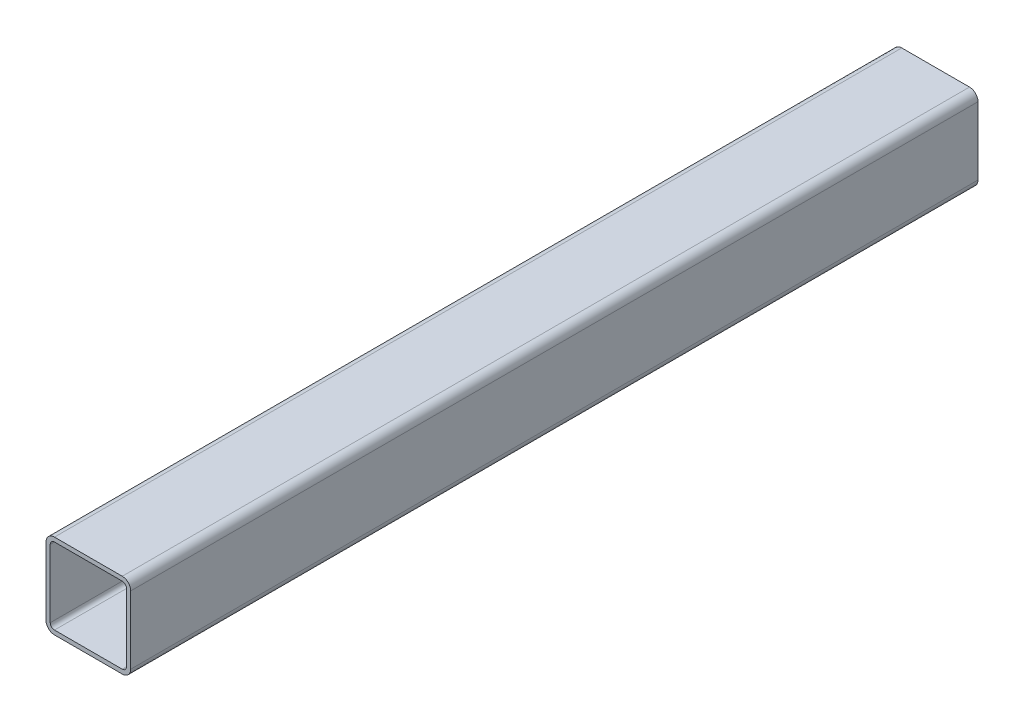
ISO-10303-21;
HEADER;
FILE_DESCRIPTION(('STEP AP214'),'2;1');
FILE_NAME('part.step','',(''),(''),'','','');
FILE_SCHEMA(('AUTOMOTIVE_DESIGN { 1 0 10303 214 1 1 1 1 }'));
ENDSEC;
DATA;
#1=APPLICATION_CONTEXT('core data for automotive mechanical design processes');
#2=APPLICATION_PROTOCOL_DEFINITION('international standard','automotive_design',2000,#1);
#3=PRODUCT_CONTEXT('',#1,'mechanical');
#4=PRODUCT('Part','Part','',(#3));
#5=PRODUCT_RELATED_PRODUCT_CATEGORY('part','',(#4));
#6=PRODUCT_DEFINITION_FORMATION('','',#4);
#7=PRODUCT_DEFINITION_CONTEXT('part definition',#1,'design');
#8=PRODUCT_DEFINITION('design','',#6,#7);
#9=PRODUCT_DEFINITION_SHAPE('','',#8);
#10=(LENGTH_UNIT() NAMED_UNIT(*) SI_UNIT(.MILLI.,.METRE.));
#11=(NAMED_UNIT(*) PLANE_ANGLE_UNIT() SI_UNIT($,.RADIAN.));
#12=(NAMED_UNIT(*) SI_UNIT($,.STERADIAN.) SOLID_ANGLE_UNIT());
#13=UNCERTAINTY_MEASURE_WITH_UNIT(LENGTH_MEASURE(1.E-05),#10,'distance_accuracy_value','');
#14=(GEOMETRIC_REPRESENTATION_CONTEXT(3) GLOBAL_UNCERTAINTY_ASSIGNED_CONTEXT((#13)) GLOBAL_UNIT_ASSIGNED_CONTEXT((#10,
#11,#12)) REPRESENTATION_CONTEXT('',''));
#15=CARTESIAN_POINT('',(0.,0.,0.));
#16=DIRECTION('',(0.,0.,1.));
#17=DIRECTION('',(1.,0.,0.));
#18=AXIS2_PLACEMENT_3D('',#15,#16,#17);
#19=CARTESIAN_POINT('',(-40.,-40.,1000.));
#20=DIRECTION('',(0.,0.,-1.));
#21=DIRECTION('',(-1.,0.,0.));
#22=AXIS2_PLACEMENT_3D('',#19,#20,#21);
#23=CYLINDRICAL_SURFACE('',#22,10.);
#24=CARTESIAN_POINT('',(-40.,-40.,0.));
#25=DIRECTION('',(0.,0.,1.));
#26=DIRECTION('',(1.,0.,0.));
#27=AXIS2_PLACEMENT_3D('',#24,#25,#26);
#28=CIRCLE('',#27,10.);
#29=CARTESIAN_POINT('',(-50.,-40.,0.));
#30=VERTEX_POINT('',#29);
#31=CARTESIAN_POINT('',(-40.,-50.,0.));
#32=VERTEX_POINT('',#31);
#33=EDGE_CURVE('E245',#30,#32,#28,.T.);
#34=ORIENTED_EDGE('',*,*,#33,.T.);
#35=DIRECTION('',(0.,0.,-1.));
#36=VECTOR('',#35,1.);
#37=CARTESIAN_POINT('',(-40.,-50.,1000.));
#38=LINE('',#37,#36);
#39=CARTESIAN_POINT('',(-40.,-50.,1000.));
#40=VERTEX_POINT('',#39);
#41=EDGE_CURVE('E12',#40,#32,#38,.T.);
#42=ORIENTED_EDGE('',*,*,#41,.F.);
#43=CARTESIAN_POINT('',(-40.,-40.,1000.));
#44=DIRECTION('',(0.,0.,1.));
#45=DIRECTION('',(1.,0.,0.));
#46=AXIS2_PLACEMENT_3D('',#43,#44,#45);
#47=CIRCLE('',#46,10.);
#48=CARTESIAN_POINT('',(-50.,-40.,1000.));
#49=VERTEX_POINT('',#48);
#50=EDGE_CURVE('E321',#49,#40,#47,.T.);
#51=ORIENTED_EDGE('',*,*,#50,.F.);
#52=DIRECTION('',(0.,0.,-1.));
#53=VECTOR('',#52,1.);
#54=CARTESIAN_POINT('',(-50.,-40.,1000.));
#55=LINE('',#54,#53);
#56=EDGE_CURVE('E256',#49,#30,#55,.T.);
#57=ORIENTED_EDGE('',*,*,#56,.T.);
#58=EDGE_LOOP('',(#34,#42,#51,#57));
#59=FACE_BOUND('',#58,.T.);
#60=ADVANCED_FACE('F72',(#59),#23,.T.);
#61=CARTESIAN_POINT('',(-40.,-50.,1000.));
#62=DIRECTION('',(0.,1.,0.));
#63=DIRECTION('',(0.,0.,1.));
#64=AXIS2_PLACEMENT_3D('',#61,#62,#63);
#65=PLANE('',#64);
#66=DIRECTION('',(1.,0.,0.));
#67=VECTOR('',#66,1.);
#68=CARTESIAN_POINT('',(-40.,-50.,0.));
#69=LINE('',#68,#67);
#70=CARTESIAN_POINT('',(40.,-50.,0.));
#71=VERTEX_POINT('',#70);
#72=EDGE_CURVE('E247',#32,#71,#69,.T.);
#73=ORIENTED_EDGE('',*,*,#72,.T.);
#74=DIRECTION('',(0.,0.,-1.));
#75=VECTOR('',#74,1.);
#76=CARTESIAN_POINT('',(40.,-50.,1000.));
#77=LINE('',#76,#75);
#78=CARTESIAN_POINT('',(40.,-50.,1000.));
#79=VERTEX_POINT('',#78);
#80=EDGE_CURVE('E83',#79,#71,#77,.T.);
#81=ORIENTED_EDGE('',*,*,#80,.F.);
#82=DIRECTION('',(1.,0.,0.));
#83=VECTOR('',#82,1.);
#84=CARTESIAN_POINT('',(-40.,-50.,1000.));
#85=LINE('',#84,#83);
#86=EDGE_CURVE('E322',#40,#79,#85,.T.);
#87=ORIENTED_EDGE('',*,*,#86,.F.);
#88=ORIENTED_EDGE('',*,*,#41,.T.);
#89=EDGE_LOOP('',(#73,#81,#87,#88));
#90=FACE_BOUND('',#89,.T.);
#91=ADVANCED_FACE('F358',(#90),#65,.F.);
#92=CARTESIAN_POINT('',(40.,-40.,1000.));
#93=DIRECTION('',(0.,0.,-1.));
#94=DIRECTION('',(-1.,0.,0.));
#95=AXIS2_PLACEMENT_3D('',#92,#93,#94);
#96=CYLINDRICAL_SURFACE('',#95,10.);
#97=CARTESIAN_POINT('',(40.,-40.,0.));
#98=DIRECTION('',(0.,0.,1.));
#99=DIRECTION('',(1.,0.,0.));
#100=AXIS2_PLACEMENT_3D('',#97,#98,#99);
#101=CIRCLE('',#100,10.);
#102=CARTESIAN_POINT('',(50.,-40.,0.));
#103=VERTEX_POINT('',#102);
#104=EDGE_CURVE('E246',#71,#103,#101,.T.);
#105=ORIENTED_EDGE('',*,*,#104,.T.);
#106=DIRECTION('',(0.,0.,-1.));
#107=VECTOR('',#106,1.);
#108=CARTESIAN_POINT('',(50.,-40.,1000.));
#109=LINE('',#108,#107);
#110=CARTESIAN_POINT('',(50.,-40.,1000.));
#111=VERTEX_POINT('',#110);
#112=EDGE_CURVE('E262',#111,#103,#109,.T.);
#113=ORIENTED_EDGE('',*,*,#112,.F.);
#114=CARTESIAN_POINT('',(40.,-40.,1000.));
#115=DIRECTION('',(0.,0.,1.));
#116=DIRECTION('',(1.,0.,0.));
#117=AXIS2_PLACEMENT_3D('',#114,#115,#116);
#118=CIRCLE('',#117,10.);
#119=EDGE_CURVE('E324',#79,#111,#118,.T.);
#120=ORIENTED_EDGE('',*,*,#119,.F.);
#121=ORIENTED_EDGE('',*,*,#80,.T.);
#122=EDGE_LOOP('',(#105,#113,#120,#121));
#123=FACE_BOUND('',#122,.T.);
#124=ADVANCED_FACE('F363',(#123),#96,.T.);
#125=CARTESIAN_POINT('',(50.,-40.,1000.));
#126=DIRECTION('',(-1.,0.,0.));
#127=DIRECTION('',(0.,0.,1.));
#128=AXIS2_PLACEMENT_3D('',#125,#126,#127);
#129=PLANE('',#128);
#130=DIRECTION('',(0.,1.,0.));
#131=VECTOR('',#130,1.);
#132=CARTESIAN_POINT('',(50.,-40.,0.));
#133=LINE('',#132,#131);
#134=CARTESIAN_POINT('',(50.,40.,0.));
#135=VERTEX_POINT('',#134);
#136=EDGE_CURVE('E248',#103,#135,#133,.T.);
#137=ORIENTED_EDGE('',*,*,#136,.T.);
#138=DIRECTION('',(0.,0.,-1.));
#139=VECTOR('',#138,1.);
#140=CARTESIAN_POINT('',(50.,40.,1000.));
#141=LINE('',#140,#139);
#142=CARTESIAN_POINT('',(50.,40.,1000.));
#143=VERTEX_POINT('',#142);
#144=EDGE_CURVE('E265',#143,#135,#141,.T.);
#145=ORIENTED_EDGE('',*,*,#144,.F.);
#146=DIRECTION('',(0.,1.,0.));
#147=VECTOR('',#146,1.);
#148=CARTESIAN_POINT('',(50.,-40.,1000.));
#149=LINE('',#148,#147);
#150=EDGE_CURVE('E330',#111,#143,#149,.T.);
#151=ORIENTED_EDGE('',*,*,#150,.F.);
#152=ORIENTED_EDGE('',*,*,#112,.T.);
#153=EDGE_LOOP('',(#137,#145,#151,#152));
#154=FACE_BOUND('',#153,.T.);
#155=ADVANCED_FACE('F335',(#154),#129,.F.);
#156=CARTESIAN_POINT('',(40.,40.,1000.));
#157=DIRECTION('',(0.,0.,-1.));
#158=DIRECTION('',(-1.,0.,0.));
#159=AXIS2_PLACEMENT_3D('',#156,#157,#158);
#160=CYLINDRICAL_SURFACE('',#159,10.);
#161=CARTESIAN_POINT('',(40.,40.,0.));
#162=DIRECTION('',(0.,0.,1.));
#163=DIRECTION('',(1.,0.,0.));
#164=AXIS2_PLACEMENT_3D('',#161,#162,#163);
#165=CIRCLE('',#164,10.);
#166=CARTESIAN_POINT('',(40.,50.,0.));
#167=VERTEX_POINT('',#166);
#168=EDGE_CURVE('E254',#135,#167,#165,.T.);
#169=ORIENTED_EDGE('',*,*,#168,.T.);
#170=DIRECTION('',(0.,0.,-1.));
#171=VECTOR('',#170,1.);
#172=CARTESIAN_POINT('',(40.,50.,1000.));
#173=LINE('',#172,#171);
#174=CARTESIAN_POINT('',(40.,50.,1000.));
#175=VERTEX_POINT('',#174);
#176=EDGE_CURVE('E208',#175,#167,#173,.T.);
#177=ORIENTED_EDGE('',*,*,#176,.F.);
#178=CARTESIAN_POINT('',(40.,40.,1000.));
#179=DIRECTION('',(0.,0.,1.));
#180=DIRECTION('',(1.,0.,0.));
#181=AXIS2_PLACEMENT_3D('',#178,#179,#180);
#182=CIRCLE('',#181,10.);
#183=EDGE_CURVE('E202',#143,#175,#182,.T.);
#184=ORIENTED_EDGE('',*,*,#183,.F.);
#185=ORIENTED_EDGE('',*,*,#144,.T.);
#186=EDGE_LOOP('',(#169,#177,#184,#185));
#187=FACE_BOUND('',#186,.T.);
#188=ADVANCED_FACE('F340',(#187),#160,.T.);
#189=CARTESIAN_POINT('',(40.,50.,1000.));
#190=DIRECTION('',(0.,-1.,0.));
#191=DIRECTION('',(0.,0.,-1.));
#192=AXIS2_PLACEMENT_3D('',#189,#190,#191);
#193=PLANE('',#192);
#194=DIRECTION('',(-1.,0.,0.));
#195=VECTOR('',#194,1.);
#196=CARTESIAN_POINT('',(40.,50.,0.));
#197=LINE('',#196,#195);
#198=CARTESIAN_POINT('',(-40.,50.,0.));
#199=VERTEX_POINT('',#198);
#200=EDGE_CURVE('E206',#167,#199,#197,.T.);
#201=ORIENTED_EDGE('',*,*,#200,.T.);
#202=DIRECTION('',(0.,0.,-1.));
#203=VECTOR('',#202,1.);
#204=CARTESIAN_POINT('',(-40.,50.,1000.));
#205=LINE('',#204,#203);
#206=CARTESIAN_POINT('',(-40.,50.,1000.));
#207=VERTEX_POINT('',#206);
#208=EDGE_CURVE('E207',#207,#199,#205,.T.);
#209=ORIENTED_EDGE('',*,*,#208,.F.);
#210=DIRECTION('',(-1.,0.,0.));
#211=VECTOR('',#210,1.);
#212=CARTESIAN_POINT('',(40.,50.,1000.));
#213=LINE('',#212,#211);
#214=EDGE_CURVE('E193',#175,#207,#213,.T.);
#215=ORIENTED_EDGE('',*,*,#214,.F.);
#216=ORIENTED_EDGE('',*,*,#176,.T.);
#217=EDGE_LOOP('',(#201,#209,#215,#216));
#218=FACE_BOUND('',#217,.T.);
#219=ADVANCED_FACE('F209',(#218),#193,.F.);
#220=CARTESIAN_POINT('',(-40.,40.,1000.));
#221=DIRECTION('',(0.,0.,-1.));
#222=DIRECTION('',(-1.,0.,0.));
#223=AXIS2_PLACEMENT_3D('',#220,#221,#222);
#224=CYLINDRICAL_SURFACE('',#223,10.);
#225=CARTESIAN_POINT('',(-40.,40.,0.));
#226=DIRECTION('',(0.,0.,1.));
#227=DIRECTION('',(1.,0.,0.));
#228=AXIS2_PLACEMENT_3D('',#225,#226,#227);
#229=CIRCLE('',#228,10.);
#230=CARTESIAN_POINT('',(-50.,40.,0.));
#231=VERTEX_POINT('',#230);
#232=EDGE_CURVE('E142',#199,#231,#229,.T.);
#233=ORIENTED_EDGE('',*,*,#232,.T.);
#234=DIRECTION('',(0.,0.,-1.));
#235=VECTOR('',#234,1.);
#236=CARTESIAN_POINT('',(-50.,40.,1000.));
#237=LINE('',#236,#235);
#238=CARTESIAN_POINT('',(-50.,40.,1000.));
#239=VERTEX_POINT('',#238);
#240=EDGE_CURVE('E213',#239,#231,#237,.T.);
#241=ORIENTED_EDGE('',*,*,#240,.F.);
#242=CARTESIAN_POINT('',(-40.,40.,1000.));
#243=DIRECTION('',(0.,0.,1.));
#244=DIRECTION('',(1.,0.,0.));
#245=AXIS2_PLACEMENT_3D('',#242,#243,#244);
#246=CIRCLE('',#245,10.);
#247=EDGE_CURVE('E196',#207,#239,#246,.T.);
#248=ORIENTED_EDGE('',*,*,#247,.F.);
#249=ORIENTED_EDGE('',*,*,#208,.T.);
#250=EDGE_LOOP('',(#233,#241,#248,#249));
#251=FACE_BOUND('',#250,.T.);
#252=ADVANCED_FACE('F211',(#251),#224,.T.);
#253=CARTESIAN_POINT('',(-40.,-40.,1000.));
#254=DIRECTION('',(0.,0.,-1.));
#255=DIRECTION('',(-1.,0.,0.));
#256=AXIS2_PLACEMENT_3D('',#253,#254,#255);
#257=CYLINDRICAL_SURFACE('',#256,5.);
#258=CARTESIAN_POINT('',(-40.,-40.,0.));
#259=DIRECTION('',(0.,0.,1.));
#260=DIRECTION('',(1.,0.,0.));
#261=AXIS2_PLACEMENT_3D('',#258,#259,#260);
#262=CIRCLE('',#261,5.);
#263=CARTESIAN_POINT('',(-45.,-40.,0.));
#264=VERTEX_POINT('',#263);
#265=CARTESIAN_POINT('',(-40.,-45.,0.));
#266=VERTEX_POINT('',#265);
#267=EDGE_CURVE('E219',#264,#266,#262,.T.);
#268=ORIENTED_EDGE('',*,*,#267,.F.);
#269=DIRECTION('',(0.,0.,-1.));
#270=VECTOR('',#269,1.);
#271=CARTESIAN_POINT('',(-45.,-40.,1000.));
#272=LINE('',#271,#270);
#273=CARTESIAN_POINT('',(-45.,-40.,1000.));
#274=VERTEX_POINT('',#273);
#275=EDGE_CURVE('E73',#274,#264,#272,.T.);
#276=ORIENTED_EDGE('',*,*,#275,.F.);
#277=CARTESIAN_POINT('',(-40.,-40.,1000.));
#278=DIRECTION('',(0.,0.,1.));
#279=DIRECTION('',(1.,0.,0.));
#280=AXIS2_PLACEMENT_3D('',#277,#278,#279);
#281=CIRCLE('',#280,5.);
#282=CARTESIAN_POINT('',(-40.,-45.,1000.));
#283=VERTEX_POINT('',#282);
#284=EDGE_CURVE('E257',#274,#283,#281,.T.);
#285=ORIENTED_EDGE('',*,*,#284,.T.);
#286=DIRECTION('',(0.,0.,-1.));
#287=VECTOR('',#286,1.);
#288=CARTESIAN_POINT('',(-40.,-45.,1000.));
#289=LINE('',#288,#287);
#290=EDGE_CURVE('E214',#283,#266,#289,.T.);
#291=ORIENTED_EDGE('',*,*,#290,.T.);
#292=EDGE_LOOP('',(#268,#276,#285,#291));
#293=FACE_BOUND('',#292,.T.);
#294=ADVANCED_FACE('F75',(#293),#257,.F.);
#295=CARTESIAN_POINT('',(-45.,40.,1000.));
#296=DIRECTION('',(1.,0.,0.));
#297=DIRECTION('',(0.,0.,-1.));
#298=AXIS2_PLACEMENT_3D('',#295,#296,#297);
#299=PLANE('',#298);
#300=DIRECTION('',(0.,-1.,0.));
#301=VECTOR('',#300,1.);
#302=CARTESIAN_POINT('',(-45.,40.,0.));
#303=LINE('',#302,#301);
#304=CARTESIAN_POINT('',(-45.,40.,0.));
#305=VERTEX_POINT('',#304);
#306=EDGE_CURVE('E225',#305,#264,#303,.T.);
#307=ORIENTED_EDGE('',*,*,#306,.F.);
#308=DIRECTION('',(0.,0.,-1.));
#309=VECTOR('',#308,1.);
#310=CARTESIAN_POINT('',(-45.,40.,1000.));
#311=LINE('',#310,#309);
#312=CARTESIAN_POINT('',(-45.,40.,1000.));
#313=VERTEX_POINT('',#312);
#314=EDGE_CURVE('E279',#313,#305,#311,.T.);
#315=ORIENTED_EDGE('',*,*,#314,.F.);
#316=DIRECTION('',(0.,-1.,0.));
#317=VECTOR('',#316,1.);
#318=CARTESIAN_POINT('',(-45.,40.,1000.));
#319=LINE('',#318,#317);
#320=EDGE_CURVE('E286',#313,#274,#319,.T.);
#321=ORIENTED_EDGE('',*,*,#320,.T.);
#322=ORIENTED_EDGE('',*,*,#275,.T.);
#323=EDGE_LOOP('',(#307,#315,#321,#322));
#324=FACE_BOUND('',#323,.T.);
#325=ADVANCED_FACE('F289',(#324),#299,.T.);
#326=CARTESIAN_POINT('',(-40.,40.,1000.));
#327=DIRECTION('',(0.,0.,-1.));
#328=DIRECTION('',(-1.,0.,0.));
#329=AXIS2_PLACEMENT_3D('',#326,#327,#328);
#330=CYLINDRICAL_SURFACE('',#329,5.);
#331=CARTESIAN_POINT('',(-40.,40.,0.));
#332=DIRECTION('',(0.,0.,1.));
#333=DIRECTION('',(1.,0.,0.));
#334=AXIS2_PLACEMENT_3D('',#331,#332,#333);
#335=CIRCLE('',#334,5.);
#336=CARTESIAN_POINT('',(-40.,45.,0.));
#337=VERTEX_POINT('',#336);
#338=EDGE_CURVE('E224',#337,#305,#335,.T.);
#339=ORIENTED_EDGE('',*,*,#338,.F.);
#340=DIRECTION('',(0.,0.,-1.));
#341=VECTOR('',#340,1.);
#342=CARTESIAN_POINT('',(-40.,45.,1000.));
#343=LINE('',#342,#341);
#344=CARTESIAN_POINT('',(-40.,45.,1000.));
#345=VERTEX_POINT('',#344);
#346=EDGE_CURVE('E278',#345,#337,#343,.T.);
#347=ORIENTED_EDGE('',*,*,#346,.F.);
#348=CARTESIAN_POINT('',(-40.,40.,1000.));
#349=DIRECTION('',(0.,0.,1.));
#350=DIRECTION('',(1.,0.,0.));
#351=AXIS2_PLACEMENT_3D('',#348,#349,#350);
#352=CIRCLE('',#351,5.);
#353=EDGE_CURVE('E299',#345,#313,#352,.T.);
#354=ORIENTED_EDGE('',*,*,#353,.T.);
#355=ORIENTED_EDGE('',*,*,#314,.T.);
#356=EDGE_LOOP('',(#339,#347,#354,#355));
#357=FACE_BOUND('',#356,.T.);
#358=ADVANCED_FACE('F293',(#357),#330,.F.);
#359=CARTESIAN_POINT('',(40.,45.,1000.));
#360=DIRECTION('',(0.,-1.,0.));
#361=DIRECTION('',(0.,0.,-1.));
#362=AXIS2_PLACEMENT_3D('',#359,#360,#361);
#363=PLANE('',#362);
#364=DIRECTION('',(-1.,0.,0.));
#365=VECTOR('',#364,1.);
#366=CARTESIAN_POINT('',(40.,45.,0.));
#367=LINE('',#366,#365);
#368=CARTESIAN_POINT('',(40.,45.,0.));
#369=VERTEX_POINT('',#368);
#370=EDGE_CURVE('E228',#369,#337,#367,.T.);
#371=ORIENTED_EDGE('',*,*,#370,.F.);
#372=DIRECTION('',(0.,0.,-1.));
#373=VECTOR('',#372,1.);
#374=CARTESIAN_POINT('',(40.,45.,1000.));
#375=LINE('',#374,#373);
#376=CARTESIAN_POINT('',(40.,45.,1000.));
#377=VERTEX_POINT('',#376);
#378=EDGE_CURVE('E280',#377,#369,#375,.T.);
#379=ORIENTED_EDGE('',*,*,#378,.F.);
#380=DIRECTION('',(-1.,0.,0.));
#381=VECTOR('',#380,1.);
#382=CARTESIAN_POINT('',(40.,45.,1000.));
#383=LINE('',#382,#381);
#384=EDGE_CURVE('E301',#377,#345,#383,.T.);
#385=ORIENTED_EDGE('',*,*,#384,.T.);
#386=ORIENTED_EDGE('',*,*,#346,.T.);
#387=EDGE_LOOP('',(#371,#379,#385,#386));
#388=FACE_BOUND('',#387,.T.);
#389=ADVANCED_FACE('F308',(#388),#363,.T.);
#390=CARTESIAN_POINT('',(40.,40.,1000.));
#391=DIRECTION('',(0.,0.,-1.));
#392=DIRECTION('',(-1.,0.,0.));
#393=AXIS2_PLACEMENT_3D('',#390,#391,#392);
#394=CYLINDRICAL_SURFACE('',#393,5.);
#395=CARTESIAN_POINT('',(40.,40.,0.));
#396=DIRECTION('',(0.,0.,1.));
#397=DIRECTION('',(1.,0.,0.));
#398=AXIS2_PLACEMENT_3D('',#395,#396,#397);
#399=CIRCLE('',#398,5.);
#400=CARTESIAN_POINT('',(45.,40.,0.));
#401=VERTEX_POINT('',#400);
#402=EDGE_CURVE('E231',#401,#369,#399,.T.);
#403=ORIENTED_EDGE('',*,*,#402,.F.);
#404=DIRECTION('',(0.,0.,-1.));
#405=VECTOR('',#404,1.);
#406=CARTESIAN_POINT('',(45.,40.,1000.));
#407=LINE('',#406,#405);
#408=CARTESIAN_POINT('',(45.,40.,1000.));
#409=VERTEX_POINT('',#408);
#410=EDGE_CURVE('E274',#409,#401,#407,.T.);
#411=ORIENTED_EDGE('',*,*,#410,.F.);
#412=CARTESIAN_POINT('',(40.,40.,1000.));
#413=DIRECTION('',(0.,0.,1.));
#414=DIRECTION('',(1.,0.,0.));
#415=AXIS2_PLACEMENT_3D('',#412,#413,#414);
#416=CIRCLE('',#415,5.);
#417=EDGE_CURVE('E310',#409,#377,#416,.T.);
#418=ORIENTED_EDGE('',*,*,#417,.T.);
#419=ORIENTED_EDGE('',*,*,#378,.T.);
#420=EDGE_LOOP('',(#403,#411,#418,#419));
#421=FACE_BOUND('',#420,.T.);
#422=ADVANCED_FACE('F371',(#421),#394,.F.);
#423=CARTESIAN_POINT('',(45.,-40.,1000.));
#424=DIRECTION('',(-1.,0.,0.));
#425=DIRECTION('',(0.,0.,1.));
#426=AXIS2_PLACEMENT_3D('',#423,#424,#425);
#427=PLANE('',#426);
#428=DIRECTION('',(0.,1.,0.));
#429=VECTOR('',#428,1.);
#430=CARTESIAN_POINT('',(45.,-40.,0.));
#431=LINE('',#430,#429);
#432=CARTESIAN_POINT('',(45.,-40.,0.));
#433=VERTEX_POINT('',#432);
#434=EDGE_CURVE('E233',#433,#401,#431,.T.);
#435=ORIENTED_EDGE('',*,*,#434,.F.);
#436=DIRECTION('',(0.,0.,-1.));
#437=VECTOR('',#436,1.);
#438=CARTESIAN_POINT('',(45.,-40.,1000.));
#439=LINE('',#438,#437);
#440=CARTESIAN_POINT('',(45.,-40.,1000.));
#441=VERTEX_POINT('',#440);
#442=EDGE_CURVE('E273',#441,#433,#439,.T.);
#443=ORIENTED_EDGE('',*,*,#442,.F.);
#444=DIRECTION('',(0.,1.,0.));
#445=VECTOR('',#444,1.);
#446=CARTESIAN_POINT('',(45.,-40.,1000.));
#447=LINE('',#446,#445);
#448=EDGE_CURVE('E309',#441,#409,#447,.T.);
#449=ORIENTED_EDGE('',*,*,#448,.T.);
#450=ORIENTED_EDGE('',*,*,#410,.T.);
#451=EDGE_LOOP('',(#435,#443,#449,#450));
#452=FACE_BOUND('',#451,.T.);
#453=ADVANCED_FACE('F369',(#452),#427,.T.);
#454=CARTESIAN_POINT('',(40.,-40.,1000.));
#455=DIRECTION('',(0.,0.,-1.));
#456=DIRECTION('',(-1.,0.,0.));
#457=AXIS2_PLACEMENT_3D('',#454,#455,#456);
#458=CYLINDRICAL_SURFACE('',#457,5.);
#459=CARTESIAN_POINT('',(40.,-40.,0.));
#460=DIRECTION('',(0.,0.,1.));
#461=DIRECTION('',(1.,0.,0.));
#462=AXIS2_PLACEMENT_3D('',#459,#460,#461);
#463=CIRCLE('',#462,5.);
#464=CARTESIAN_POINT('',(40.,-45.,0.));
#465=VERTEX_POINT('',#464);
#466=EDGE_CURVE('E240',#465,#433,#463,.T.);
#467=ORIENTED_EDGE('',*,*,#466,.F.);
#468=DIRECTION('',(0.,0.,-1.));
#469=VECTOR('',#468,1.);
#470=CARTESIAN_POINT('',(40.,-45.,1000.));
#471=LINE('',#470,#469);
#472=CARTESIAN_POINT('',(40.,-45.,1000.));
#473=VERTEX_POINT('',#472);
#474=EDGE_CURVE('E271',#473,#465,#471,.T.);
#475=ORIENTED_EDGE('',*,*,#474,.F.);
#476=CARTESIAN_POINT('',(40.,-40.,1000.));
#477=DIRECTION('',(0.,0.,1.));
#478=DIRECTION('',(1.,0.,0.));
#479=AXIS2_PLACEMENT_3D('',#476,#477,#478);
#480=CIRCLE('',#479,5.);
#481=EDGE_CURVE('E314',#473,#441,#480,.T.);
#482=ORIENTED_EDGE('',*,*,#481,.T.);
#483=ORIENTED_EDGE('',*,*,#442,.T.);
#484=EDGE_LOOP('',(#467,#475,#482,#483));
#485=FACE_BOUND('',#484,.T.);
#486=ADVANCED_FACE('F355',(#485),#458,.F.);
#487=CARTESIAN_POINT('',(-40.,-45.,1000.));
#488=DIRECTION('',(0.,1.,0.));
#489=DIRECTION('',(0.,0.,1.));
#490=AXIS2_PLACEMENT_3D('',#487,#488,#489);
#491=PLANE('',#490);
#492=DIRECTION('',(1.,0.,0.));
#493=VECTOR('',#492,1.);
#494=CARTESIAN_POINT('',(-40.,-45.,0.));
#495=LINE('',#494,#493);
#496=EDGE_CURVE('E238',#266,#465,#495,.T.);
#497=ORIENTED_EDGE('',*,*,#496,.F.);
#498=ORIENTED_EDGE('',*,*,#290,.F.);
#499=DIRECTION('',(1.,0.,0.));
#500=VECTOR('',#499,1.);
#501=CARTESIAN_POINT('',(-40.,-45.,1000.));
#502=LINE('',#501,#500);
#503=EDGE_CURVE('E318',#283,#473,#502,.T.);
#504=ORIENTED_EDGE('',*,*,#503,.T.);
#505=ORIENTED_EDGE('',*,*,#474,.T.);
#506=EDGE_LOOP('',(#497,#498,#504,#505));
#507=FACE_BOUND('',#506,.T.);
#508=ADVANCED_FACE('F343',(#507),#491,.T.);
#509=CARTESIAN_POINT('',(-50.,40.,1000.));
#510=DIRECTION('',(1.,0.,0.));
#511=DIRECTION('',(0.,0.,-1.));
#512=AXIS2_PLACEMENT_3D('',#509,#510,#511);
#513=PLANE('',#512);
#514=DIRECTION('',(0.,-1.,0.));
#515=VECTOR('',#514,1.);
#516=CARTESIAN_POINT('',(-50.,40.,0.));
#517=LINE('',#516,#515);
#518=EDGE_CURVE('E146',#231,#30,#517,.T.);
#519=ORIENTED_EDGE('',*,*,#518,.T.);
#520=ORIENTED_EDGE('',*,*,#56,.F.);
#521=DIRECTION('',(0.,-1.,0.));
#522=VECTOR('',#521,1.);
#523=CARTESIAN_POINT('',(-50.,40.,1000.));
#524=LINE('',#523,#522);
#525=EDGE_CURVE('E89',#239,#49,#524,.T.);
#526=ORIENTED_EDGE('',*,*,#525,.F.);
#527=ORIENTED_EDGE('',*,*,#240,.T.);
#528=EDGE_LOOP('',(#519,#520,#526,#527));
#529=FACE_BOUND('',#528,.T.);
#530=ADVANCED_FACE('F345',(#529),#513,.F.);
#531=CARTESIAN_POINT('',(-40.,-40.,1000.));
#532=DIRECTION('',(0.,0.,1.));
#533=DIRECTION('',(1.,0.,0.));
#534=AXIS2_PLACEMENT_3D('',#531,#532,#533);
#535=PLANE('',#534);
#536=ORIENTED_EDGE('',*,*,#284,.F.);
#537=ORIENTED_EDGE('',*,*,#320,.F.);
#538=ORIENTED_EDGE('',*,*,#353,.F.);
#539=ORIENTED_EDGE('',*,*,#384,.F.);
#540=ORIENTED_EDGE('',*,*,#417,.F.);
#541=ORIENTED_EDGE('',*,*,#448,.F.);
#542=ORIENTED_EDGE('',*,*,#481,.F.);
#543=ORIENTED_EDGE('',*,*,#503,.F.);
#544=EDGE_LOOP('',(#536,#537,#538,#539,#540,#541,#542,#543));
#545=FACE_BOUND('',#544,.T.);
#546=ORIENTED_EDGE('',*,*,#50,.T.);
#547=ORIENTED_EDGE('',*,*,#86,.T.);
#548=ORIENTED_EDGE('',*,*,#119,.T.);
#549=ORIENTED_EDGE('',*,*,#150,.T.);
#550=ORIENTED_EDGE('',*,*,#183,.T.);
#551=ORIENTED_EDGE('',*,*,#214,.T.);
#552=ORIENTED_EDGE('',*,*,#247,.T.);
#553=ORIENTED_EDGE('',*,*,#525,.T.);
#554=EDGE_LOOP('',(#546,#547,#548,#549,#550,#551,#552,#553));
#555=FACE_BOUND('',#554,.T.);
#556=ADVANCED_FACE('F199',(#545,#555),#535,.T.);
#557=CARTESIAN_POINT('',(-40.,-40.,0.));
#558=DIRECTION('',(0.,0.,1.));
#559=DIRECTION('',(1.,0.,0.));
#560=AXIS2_PLACEMENT_3D('',#557,#558,#559);
#561=PLANE('',#560);
#562=ORIENTED_EDGE('',*,*,#267,.T.);
#563=ORIENTED_EDGE('',*,*,#496,.T.);
#564=ORIENTED_EDGE('',*,*,#466,.T.);
#565=ORIENTED_EDGE('',*,*,#434,.T.);
#566=ORIENTED_EDGE('',*,*,#402,.T.);
#567=ORIENTED_EDGE('',*,*,#370,.T.);
#568=ORIENTED_EDGE('',*,*,#338,.T.);
#569=ORIENTED_EDGE('',*,*,#306,.T.);
#570=EDGE_LOOP('',(#562,#563,#564,#565,#566,#567,#568,#569));
#571=FACE_BOUND('',#570,.T.);
#572=ORIENTED_EDGE('',*,*,#33,.F.);
#573=ORIENTED_EDGE('',*,*,#518,.F.);
#574=ORIENTED_EDGE('',*,*,#232,.F.);
#575=ORIENTED_EDGE('',*,*,#200,.F.);
#576=ORIENTED_EDGE('',*,*,#168,.F.);
#577=ORIENTED_EDGE('',*,*,#136,.F.);
#578=ORIENTED_EDGE('',*,*,#104,.F.);
#579=ORIENTED_EDGE('',*,*,#72,.F.);
#580=EDGE_LOOP('',(#572,#573,#574,#575,#576,#577,#578,#579));
#581=FACE_BOUND('',#580,.T.);
#582=ADVANCED_FACE('F295',(#571,#581),#561,.F.);
#583=CLOSED_SHELL('',(#60,#91,#124,#155,#188,#219,#252,#294,#325,#358,#389,#422,#453,#486,#508,
#530,#556,#582));
#584=MANIFOLD_SOLID_BREP('B2',#583);
#585=ADVANCED_BREP_SHAPE_REPRESENTATION('',(#18,#584),#14);
#586=SHAPE_DEFINITION_REPRESENTATION(#9,#585);
ENDSEC;
END-ISO-10303-21;
